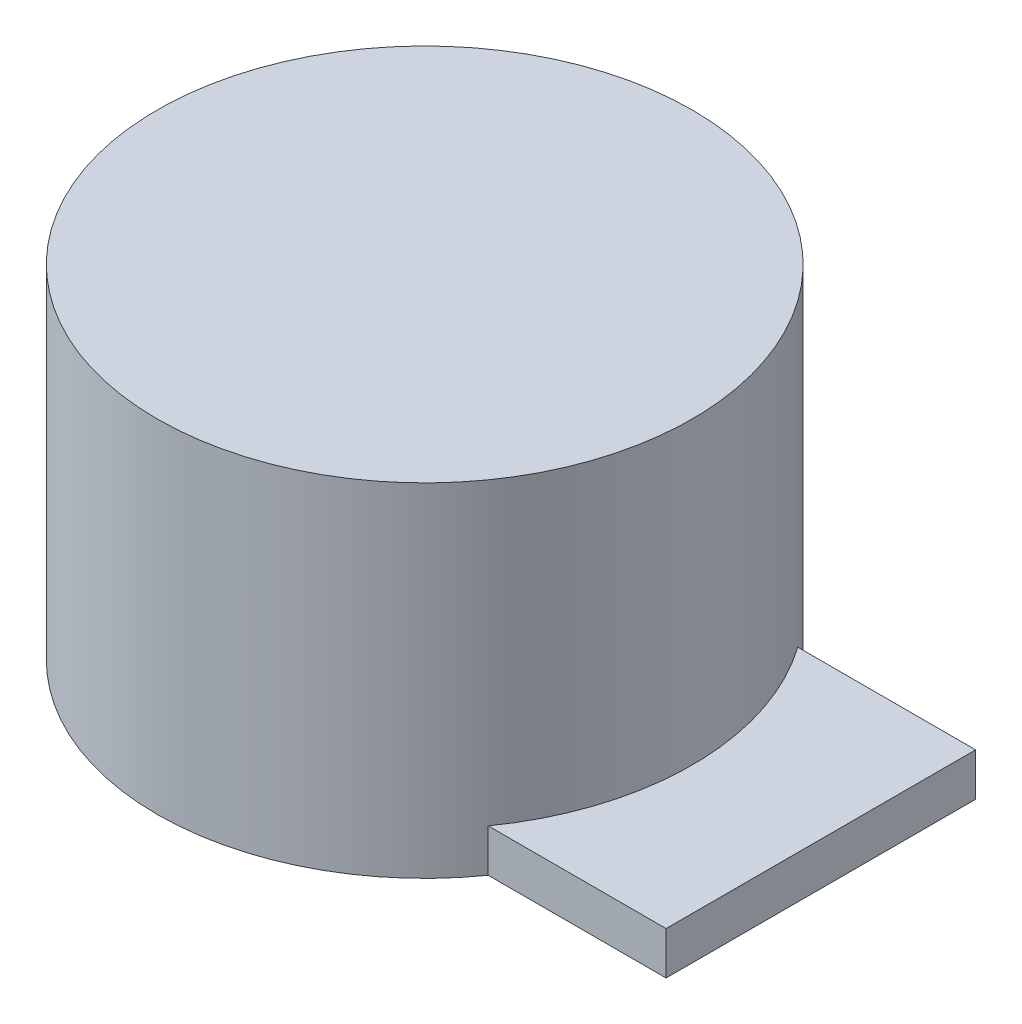
ISO-10303-21;
HEADER;
FILE_DESCRIPTION(('STEP AP214'),'2;1');
FILE_NAME('part.step','',(''),(''),'','','');
FILE_SCHEMA(('AUTOMOTIVE_DESIGN { 1 0 10303 214 1 1 1 1 }'));
ENDSEC;
DATA;
#1=APPLICATION_CONTEXT('core data for automotive mechanical design processes');
#2=APPLICATION_PROTOCOL_DEFINITION('international standard','automotive_design',2000,#1);
#3=PRODUCT_CONTEXT('',#1,'mechanical');
#4=PRODUCT('Part','Part','',(#3));
#5=PRODUCT_RELATED_PRODUCT_CATEGORY('part','',(#4));
#6=PRODUCT_DEFINITION_FORMATION('','',#4);
#7=PRODUCT_DEFINITION_CONTEXT('part definition',#1,'design');
#8=PRODUCT_DEFINITION('design','',#6,#7);
#9=PRODUCT_DEFINITION_SHAPE('','',#8);
#10=(LENGTH_UNIT() NAMED_UNIT(*) SI_UNIT(.MILLI.,.METRE.));
#11=(NAMED_UNIT(*) PLANE_ANGLE_UNIT() SI_UNIT($,.RADIAN.));
#12=(NAMED_UNIT(*) SI_UNIT($,.STERADIAN.) SOLID_ANGLE_UNIT());
#13=UNCERTAINTY_MEASURE_WITH_UNIT(LENGTH_MEASURE(1.E-05),#10,'distance_accuracy_value','');
#14=(GEOMETRIC_REPRESENTATION_CONTEXT(3) GLOBAL_UNCERTAINTY_ASSIGNED_CONTEXT((#13)) GLOBAL_UNIT_ASSIGNED_CONTEXT((#10,
#11,#12)) REPRESENTATION_CONTEXT('',''));
#15=CARTESIAN_POINT('',(0.,0.,0.));
#16=DIRECTION('',(0.,0.,1.));
#17=DIRECTION('',(1.,0.,0.));
#18=AXIS2_PLACEMENT_3D('',#15,#16,#17);
#19=CARTESIAN_POINT('',(0.,20.32,0.));
#20=DIRECTION('',(0.,-1.,0.));
#21=DIRECTION('',(0.,0.,-1.));
#22=AXIS2_PLACEMENT_3D('',#19,#20,#21);
#23=CYLINDRICAL_SURFACE('',#22,15.875);
#24=CARTESIAN_POINT('',(0.,0.,0.));
#25=DIRECTION('',(0.,1.,0.));
#26=DIRECTION('',(0.,0.,1.));
#27=AXIS2_PLACEMENT_3D('',#24,#25,#26);
#28=CIRCLE('',#27,15.875);
#29=CARTESIAN_POINT('',(12.9497091390884,0.,-9.18262806679062));
#30=VERTEX_POINT('',#29);
#31=CARTESIAN_POINT('',(12.9497091390884,0.,9.18262806679062));
#32=VERTEX_POINT('',#31);
#33=EDGE_CURVE('E104',#30,#32,#28,.T.);
#34=ORIENTED_EDGE('',*,*,#33,.T.);
#35=DIRECTION('',(0.,-1.,0.));
#36=VECTOR('',#35,1.);
#37=CARTESIAN_POINT('',(12.9497091390884,20.32,9.18262806679062));
#38=LINE('',#37,#36);
#39=CARTESIAN_POINT('',(12.9497091390884,2.54,9.18262806679062));
#40=VERTEX_POINT('',#39);
#41=EDGE_CURVE('E50',#32,#40,#38,.F.);
#42=ORIENTED_EDGE('',*,*,#41,.T.);
#43=CARTESIAN_POINT('',(0.,2.54,0.));
#44=DIRECTION('',(0.,1.,0.));
#45=DIRECTION('',(0.,0.,1.));
#46=AXIS2_PLACEMENT_3D('',#43,#44,#45);
#47=CIRCLE('',#46,15.875);
#48=CARTESIAN_POINT('',(12.9497091390884,2.54,-9.18262806679062));
#49=VERTEX_POINT('',#48);
#50=EDGE_CURVE('E11',#40,#49,#47,.T.);
#51=ORIENTED_EDGE('',*,*,#50,.T.);
#52=DIRECTION('',(0.,-1.,0.));
#53=VECTOR('',#52,1.);
#54=CARTESIAN_POINT('',(12.9497091390884,20.32,-9.18262806679062));
#55=LINE('',#54,#53);
#56=EDGE_CURVE('E76',#49,#30,#55,.T.);
#57=ORIENTED_EDGE('',*,*,#56,.T.);
#58=EDGE_LOOP('',(#34,#42,#51,#57));
#59=FACE_BOUND('',#58,.T.);
#60=CARTESIAN_POINT('',(0.,20.32,0.));
#61=DIRECTION('',(0.,1.,0.));
#62=DIRECTION('',(0.,0.,1.));
#63=AXIS2_PLACEMENT_3D('',#60,#61,#62);
#64=CIRCLE('',#63,15.875);
#65=CARTESIAN_POINT('',(0.,20.32,15.875));
#66=VERTEX_POINT('',#65);
#67=EDGE_CURVE('E40',#66,#66,#64,.T.);
#68=ORIENTED_EDGE('',*,*,#67,.F.);
#69=EDGE_LOOP('',(#68));
#70=FACE_BOUND('',#69,.T.);
#71=ADVANCED_FACE('F33',(#59,#70),#23,.T.);
#72=CARTESIAN_POINT('',(0.,20.32,0.));
#73=DIRECTION('',(0.,1.,0.));
#74=DIRECTION('',(0.,0.,1.));
#75=AXIS2_PLACEMENT_3D('',#72,#73,#74);
#76=PLANE('',#75);
#77=ORIENTED_EDGE('',*,*,#67,.T.);
#78=EDGE_LOOP('',(#77));
#79=FACE_BOUND('',#78,.T.);
#80=ADVANCED_FACE('F113',(#79),#76,.T.);
#81=CARTESIAN_POINT('',(0.,0.,0.));
#82=DIRECTION('',(0.,1.,0.));
#83=DIRECTION('',(0.,0.,1.));
#84=AXIS2_PLACEMENT_3D('',#81,#82,#83);
#85=PLANE('',#84);
#86=ORIENTED_EDGE('',*,*,#33,.F.);
#87=DIRECTION('',(1.,0.,0.));
#88=VECTOR('',#87,1.);
#89=CARTESIAN_POINT('',(23.5014420808485,0.,-9.18262806679062));
#90=LINE('',#89,#88);
#91=CARTESIAN_POINT('',(23.5014420808485,0.,-9.18262806679062));
#92=VERTEX_POINT('',#91);
#93=EDGE_CURVE('E96',#30,#92,#90,.T.);
#94=ORIENTED_EDGE('',*,*,#93,.T.);
#95=DIRECTION('',(0.,0.,1.));
#96=VECTOR('',#95,1.);
#97=CARTESIAN_POINT('',(23.5014420808485,0.,9.18262806679062));
#98=LINE('',#97,#96);
#99=CARTESIAN_POINT('',(23.5014420808485,0.,9.18262806679062));
#100=VERTEX_POINT('',#99);
#101=EDGE_CURVE('E87',#92,#100,#98,.T.);
#102=ORIENTED_EDGE('',*,*,#101,.T.);
#103=DIRECTION('',(-1.,0.,0.));
#104=VECTOR('',#103,1.);
#105=CARTESIAN_POINT('',(23.5014420808485,0.,9.18262806679062));
#106=LINE('',#105,#104);
#107=EDGE_CURVE('E80',#100,#32,#106,.T.);
#108=ORIENTED_EDGE('',*,*,#107,.T.);
#109=EDGE_LOOP('',(#86,#94,#102,#108));
#110=FACE_BOUND('',#109,.T.);
#111=ADVANCED_FACE('F111',(#110),#85,.F.);
#112=CARTESIAN_POINT('',(23.5014420808485,2.54,9.18262806679062));
#113=DIRECTION('',(0.,0.,1.));
#114=DIRECTION('',(1.,0.,0.));
#115=AXIS2_PLACEMENT_3D('',#112,#113,#114);
#116=PLANE('',#115);
#117=ORIENTED_EDGE('',*,*,#41,.F.);
#118=ORIENTED_EDGE('',*,*,#107,.F.);
#119=DIRECTION('',(0.,-1.,0.));
#120=VECTOR('',#119,1.);
#121=CARTESIAN_POINT('',(23.5014420808485,2.54,9.18262806679062));
#122=LINE('',#121,#120);
#123=CARTESIAN_POINT('',(23.5014420808485,2.54,9.18262806679062));
#124=VERTEX_POINT('',#123);
#125=EDGE_CURVE('E88',#124,#100,#122,.T.);
#126=ORIENTED_EDGE('',*,*,#125,.F.);
#127=DIRECTION('',(-1.,0.,0.));
#128=VECTOR('',#127,1.);
#129=CARTESIAN_POINT('',(23.5014420808485,2.54,9.18262806679062));
#130=LINE('',#129,#128);
#131=EDGE_CURVE('E89',#124,#40,#130,.T.);
#132=ORIENTED_EDGE('',*,*,#131,.T.);
#133=EDGE_LOOP('',(#117,#118,#126,#132));
#134=FACE_BOUND('',#133,.T.);
#135=ADVANCED_FACE('F110',(#134),#116,.T.);
#136=CARTESIAN_POINT('',(23.5014420808485,2.54,-9.18262806679062));
#137=DIRECTION('',(0.,0.,-1.));
#138=DIRECTION('',(-1.,0.,0.));
#139=AXIS2_PLACEMENT_3D('',#136,#137,#138);
#140=PLANE('',#139);
#141=ORIENTED_EDGE('',*,*,#56,.F.);
#142=DIRECTION('',(1.,0.,0.));
#143=VECTOR('',#142,1.);
#144=CARTESIAN_POINT('',(23.5014420808485,2.54,-9.18262806679062));
#145=LINE('',#144,#143);
#146=CARTESIAN_POINT('',(23.5014420808485,2.54,-9.18262806679062));
#147=VERTEX_POINT('',#146);
#148=EDGE_CURVE('E70',#49,#147,#145,.T.);
#149=ORIENTED_EDGE('',*,*,#148,.T.);
#150=DIRECTION('',(0.,-1.,0.));
#151=VECTOR('',#150,1.);
#152=CARTESIAN_POINT('',(23.5014420808485,2.54,-9.18262806679062));
#153=LINE('',#152,#151);
#154=EDGE_CURVE('E74',#147,#92,#153,.T.);
#155=ORIENTED_EDGE('',*,*,#154,.T.);
#156=ORIENTED_EDGE('',*,*,#93,.F.);
#157=EDGE_LOOP('',(#141,#149,#155,#156));
#158=FACE_BOUND('',#157,.T.);
#159=ADVANCED_FACE('F72',(#158),#140,.T.);
#160=CARTESIAN_POINT('',(23.5014420808485,2.54,9.18262806679062));
#161=DIRECTION('',(1.,0.,0.));
#162=DIRECTION('',(0.,0.,-1.));
#163=AXIS2_PLACEMENT_3D('',#160,#161,#162);
#164=PLANE('',#163);
#165=ORIENTED_EDGE('',*,*,#101,.F.);
#166=ORIENTED_EDGE('',*,*,#154,.F.);
#167=DIRECTION('',(0.,0.,1.));
#168=VECTOR('',#167,1.);
#169=CARTESIAN_POINT('',(23.5014420808485,2.54,9.18262806679062));
#170=LINE('',#169,#168);
#171=EDGE_CURVE('E79',#147,#124,#170,.T.);
#172=ORIENTED_EDGE('',*,*,#171,.T.);
#173=ORIENTED_EDGE('',*,*,#125,.T.);
#174=EDGE_LOOP('',(#165,#166,#172,#173));
#175=FACE_BOUND('',#174,.T.);
#176=ADVANCED_FACE('F84',(#175),#164,.T.);
#177=CARTESIAN_POINT('',(0.,2.54,0.));
#178=DIRECTION('',(0.,1.,0.));
#179=DIRECTION('',(0.,0.,1.));
#180=AXIS2_PLACEMENT_3D('',#177,#178,#179);
#181=PLANE('',#180);
#182=ORIENTED_EDGE('',*,*,#50,.F.);
#183=ORIENTED_EDGE('',*,*,#131,.F.);
#184=ORIENTED_EDGE('',*,*,#171,.F.);
#185=ORIENTED_EDGE('',*,*,#148,.F.);
#186=EDGE_LOOP('',(#182,#183,#184,#185));
#187=FACE_BOUND('',#186,.T.);
#188=ADVANCED_FACE('F91',(#187),#181,.T.);
#189=CLOSED_SHELL('',(#71,#80,#111,#135,#159,#176,#188));
#190=MANIFOLD_SOLID_BREP('B2',#189);
#191=ADVANCED_BREP_SHAPE_REPRESENTATION('',(#18,#190),#14);
#192=SHAPE_DEFINITION_REPRESENTATION(#9,#191);
ENDSEC;
END-ISO-10303-21;
